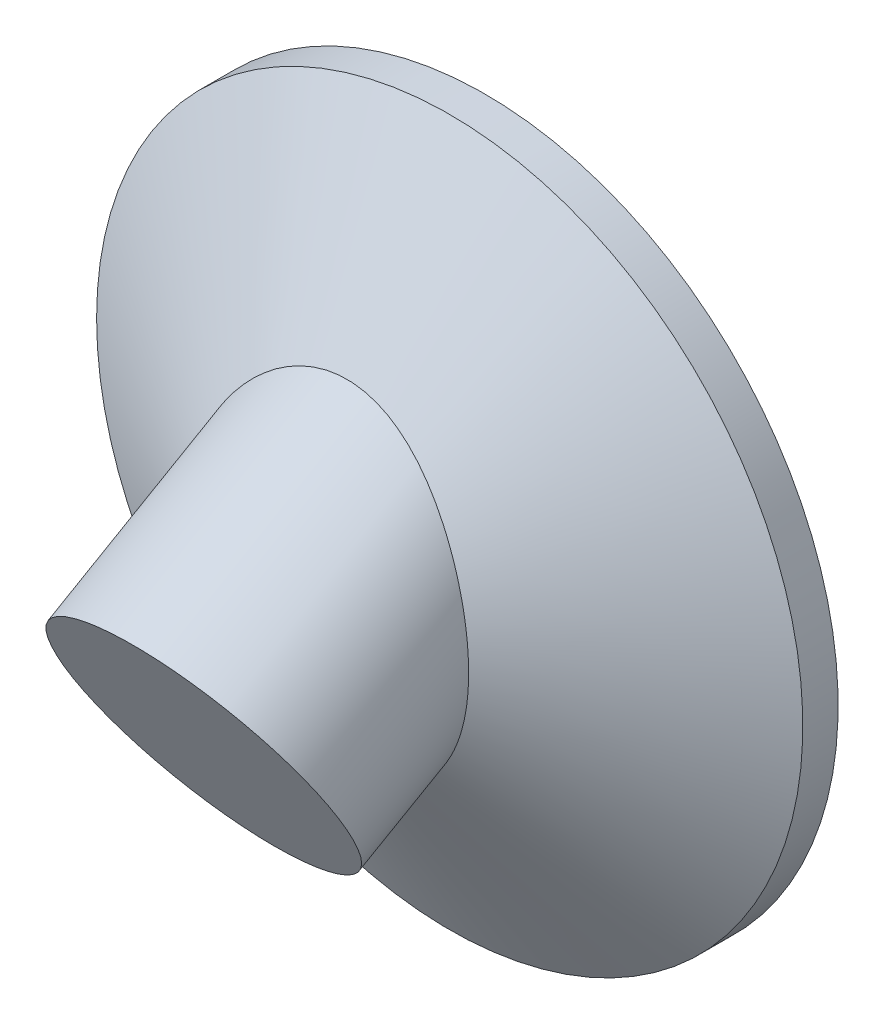
ISO-10303-21;
HEADER;
FILE_DESCRIPTION(('STEP AP214'),'2;1');
FILE_NAME('part.step','',(''),(''),'','','');
FILE_SCHEMA(('AUTOMOTIVE_DESIGN { 1 0 10303 214 1 1 1 1 }'));
ENDSEC;
DATA;
#1=APPLICATION_CONTEXT('core data for automotive mechanical design processes');
#2=APPLICATION_PROTOCOL_DEFINITION('international standard','automotive_design',2000,#1);
#3=PRODUCT_CONTEXT('',#1,'mechanical');
#4=PRODUCT('Part','Part','',(#3));
#5=PRODUCT_RELATED_PRODUCT_CATEGORY('part','',(#4));
#6=PRODUCT_DEFINITION_FORMATION('','',#4);
#7=PRODUCT_DEFINITION_CONTEXT('part definition',#1,'design');
#8=PRODUCT_DEFINITION('design','',#6,#7);
#9=PRODUCT_DEFINITION_SHAPE('','',#8);
#10=(LENGTH_UNIT() NAMED_UNIT(*) SI_UNIT(.MILLI.,.METRE.));
#11=(NAMED_UNIT(*) PLANE_ANGLE_UNIT() SI_UNIT($,.RADIAN.));
#12=(NAMED_UNIT(*) SI_UNIT($,.STERADIAN.) SOLID_ANGLE_UNIT());
#13=UNCERTAINTY_MEASURE_WITH_UNIT(LENGTH_MEASURE(1.E-05),#10,'distance_accuracy_value','');
#14=(GEOMETRIC_REPRESENTATION_CONTEXT(3) GLOBAL_UNCERTAINTY_ASSIGNED_CONTEXT((#13)) GLOBAL_UNIT_ASSIGNED_CONTEXT((#10,
#11,#12)) REPRESENTATION_CONTEXT('',''));
#15=CARTESIAN_POINT('',(0.,0.,0.));
#16=DIRECTION('',(0.,0.,1.));
#17=DIRECTION('',(1.,0.,0.));
#18=AXIS2_PLACEMENT_3D('',#15,#16,#17);
#19=CARTESIAN_POINT('',(0.,0.,400.));
#20=DIRECTION('',(0.,0.,-1.));
#21=DIRECTION('',(-1.,0.,0.));
#22=AXIS2_PLACEMENT_3D('',#19,#20,#21);
#23=CONICAL_SURFACE('',#22,393.782217350894,1.0471975511966);
#24=CARTESIAN_POINT('',(-229.09424891116,-365.963690831646,378.075589441035));
#25=CARTESIAN_POINT('',(-225.220985470825,-368.934261870913,377.808440544668));
#26=CARTESIAN_POINT('',(-221.292566342555,-371.833844226042,377.545559549312));
#27=CARTESIAN_POINT('',(-215.321028029195,-376.072422934504,377.158541626063));
#28=CARTESIAN_POINT('',(-213.317237199854,-377.466899573177,377.030745230166));
#29=CARTESIAN_POINT('',(-209.283781039525,-380.218387916195,376.777717117129));
#30=CARTESIAN_POINT('',(-207.254114465849,-381.575397811208,376.652485523923));
#31=CARTESIAN_POINT('',(-201.126098372854,-385.589973216121,376.280781087216));
#32=CARTESIAN_POINT('',(-196.989804597707,-388.190323212593,376.038368180554));
#33=CARTESIAN_POINT('',(-188.621579470081,-393.233207318196,375.56546856309));
#34=CARTESIAN_POINT('',(-184.389648412623,-395.675741914064,375.334981815507));
#35=CARTESIAN_POINT('',(-175.827738551275,-400.402550762964,374.8865468021));
#36=CARTESIAN_POINT('',(-171.497598577834,-402.686535466992,374.668621593584));
#37=CARTESIAN_POINT('',(-162.752280975462,-407.086882903538,374.246728166072));
#38=CARTESIAN_POINT('',(-158.337103103793,-409.203245157493,374.042759986924));
#39=CARTESIAN_POINT('',(-149.427873960284,-413.26395143235,373.649701345051));
#40=CARTESIAN_POINT('',(-144.93382587351,-415.208302380622,373.460610283217));
#41=CARTESIAN_POINT('',(-135.872937230799,-418.921050386896,373.098144944439));
#42=CARTESIAN_POINT('',(-131.306095524679,-420.689444661471,372.924770916123));
#43=CARTESIAN_POINT('',(-121.608637907434,-424.228064244648,372.576664271693));
#44=CARTESIAN_POINT('',(-116.470463517575,-425.977805496208,372.403812408992));
#45=CARTESIAN_POINT('',(-106.122060668215,-429.25194398588,372.079335628144));
#46=CARTESIAN_POINT('',(-100.911830808049,-430.776336836759,371.927711123269));
#47=CARTESIAN_POINT('',(-90.4284945048398,-433.59578917208,371.646524433281));
#48=CARTESIAN_POINT('',(-85.1553816576592,-434.890825081714,371.516964516164));
#49=CARTESIAN_POINT('',(-74.5568322866186,-437.247813221586,371.280654777672));
#50=CARTESIAN_POINT('',(-69.2313960689385,-438.309766814901,371.173904822903));
#51=CARTESIAN_POINT('',(-58.5401718055689,-440.197348663617,370.983846562697));
#52=CARTESIAN_POINT('',(-53.1743975079992,-441.023053995841,370.900530611985));
#53=CARTESIAN_POINT('',(-42.4112286019664,-442.43629333628,370.757764442436));
#54=CARTESIAN_POINT('',(-37.0138338752264,-443.023826453027,370.698314312927));
#55=CARTESIAN_POINT('',(-26.1984044518984,-443.959033844492,370.603619492256));
#56=CARTESIAN_POINT('',(-20.7803709602535,-444.306721912531,370.568373409135));
#57=CARTESIAN_POINT('',(-9.93414022671756,-444.761304732976,370.522281497984));
#58=CARTESIAN_POINT('',(-4.50594308695869,-444.868201892174,370.511435426066));
#59=CARTESIAN_POINT('',(6.09804818298498,-444.84154482305,370.514139281232));
#60=CARTESIAN_POINT('',(11.2738733353614,-444.718911691135,370.526581163707));
#61=CARTESIAN_POINT('',(21.6155643898023,-444.254727251323,370.573643791296));
#62=CARTESIAN_POINT('',(26.7814303821282,-443.91317793694,370.608264334446));
#63=CARTESIAN_POINT('',(37.0937638435603,-443.012053892686,370.699504554952));
#64=CARTESIAN_POINT('',(42.2402318399405,-442.452485132777,370.75612362993));
#65=CARTESIAN_POINT('',(52.5047031312823,-441.116755081609,370.891069584084));
#66=CARTESIAN_POINT('',(57.6227063583902,-440.340593274265,370.969396514984));
#67=CARTESIAN_POINT('',(67.820739089883,-438.573724025975,371.147348662458));
#68=CARTESIAN_POINT('',(72.9007715997711,-437.583033755731,371.24697217446));
#69=CARTESIAN_POINT('',(83.0143722640566,-435.389569673902,371.467010904498));
#70=CARTESIAN_POINT('',(88.0479404416382,-434.186795968145,371.587426112158));
#71=CARTESIAN_POINT('',(98.0599610625413,-431.572155313784,371.848434327165));
#72=CARTESIAN_POINT('',(103.03841319852,-430.16028719984,371.989027446968));
#73=CARTESIAN_POINT('',(112.931749036702,-427.130933774838,372.289676062289));
#74=CARTESIAN_POINT('',(117.846632748075,-425.513448493437,372.449731555001));
#75=CARTESIAN_POINT('',(127.593554059827,-422.08070016125,372.788107504203));
#76=CARTESIAN_POINT('',(132.425755195115,-420.265897115304,372.966385423141));
#77=CARTESIAN_POINT('',(142.01101491588,-416.439805838291,373.340613086317));
#78=CARTESIAN_POINT('',(146.764073543643,-414.428517712209,373.536562821114));
#79=CARTESIAN_POINT('',(156.183555605116,-410.214155578379,373.945152097404));
#80=CARTESIAN_POINT('',(160.849980288353,-408.011084339344,374.157791397952));
#81=CARTESIAN_POINT('',(170.089199732178,-403.418137007194,374.598704578814));
#82=CARTESIAN_POINT('',(174.661994429413,-401.028260787687,374.826978469707));
#83=CARTESIAN_POINT('',(183.707615734614,-396.066816552609,375.298048612042));
#84=CARTESIAN_POINT('',(188.180434340469,-393.495234061288,375.540846020272));
#85=CARTESIAN_POINT('',(197.019404171623,-388.176129426381,376.039747718072));
#86=CARTESIAN_POINT('',(201.385555587136,-385.42860759657,376.295851983911));
#87=CARTESIAN_POINT('',(210.005372755532,-379.763365018349,376.820113640516));
#88=CARTESIAN_POINT('',(214.259036091053,-376.845640616606,377.088271289975));
#89=CARTESIAN_POINT('',(222.64826790276,-370.846042053312,377.635319415051));
#90=CARTESIAN_POINT('',(226.783835550893,-367.764166741218,377.914209965891));
#91=CARTESIAN_POINT('',(235.117889815604,-361.297999290103,378.494315340448));
#92=CARTESIAN_POINT('',(239.310618602893,-357.90632342274,378.795967962119));
#93=CARTESIAN_POINT('',(247.555911173025,-350.957423067747,379.407900772524));
#94=CARTESIAN_POINT('',(251.608473867224,-347.400197294824,379.718181028233));
#95=CARTESIAN_POINT('',(259.56851461274,-340.127495628096,380.34570886134));
#96=CARTESIAN_POINT('',(263.475990965399,-336.412017882584,380.662956520244));
#97=CARTESIAN_POINT('',(271.141305159666,-328.830272902782,381.302711039202));
#98=CARTESIAN_POINT('',(274.899143186229,-324.964005854882,381.625217892756));
#99=CARTESIAN_POINT('',(282.261817427334,-317.087413841044,382.273812217063));
#100=CARTESIAN_POINT('',(285.866625127298,-313.077062282231,382.599900340999));
#101=CARTESIAN_POINT('',(292.91886249226,-304.920487518369,383.253827596048));
#102=CARTESIAN_POINT('',(296.36629251646,-300.774264623471,383.581666723162));
#103=CARTESIAN_POINT('',(303.100656318158,-292.35332624773,384.237311179028));
#104=CARTESIAN_POINT('',(306.387586190077,-288.078607644181,384.565116506764));
#105=CARTESIAN_POINT('',(312.798064318745,-279.408224545863,385.218874239426));
#106=CARTESIAN_POINT('',(315.921610793117,-275.01255873246,385.544826624103));
#107=CARTESIAN_POINT('',(322.245551346383,-265.752355520928,386.218919364916));
#108=CARTESIAN_POINT('',(325.432186553196,-260.87839418998,386.566754612076));
#109=CARTESIAN_POINT('',(331.60951303968,-251.007375212451,387.255824224914));
#110=CARTESIAN_POINT('',(334.600201760248,-246.010315959357,387.597058504341));
#111=CARTESIAN_POINT('',(340.383580243321,-235.902144736845,388.270619076197));
#112=CARTESIAN_POINT('',(343.176263879062,-230.791029244674,388.602945092784));
#113=CARTESIAN_POINT('',(348.561842464576,-220.463956089223,389.256365497953));
#114=CARTESIAN_POINT('',(351.154737919751,-215.247998691202,389.577459914947));
#115=CARTESIAN_POINT('',(356.14013031367,-204.718781839557,390.206198939203));
#116=CARTESIAN_POINT('',(358.532575801524,-199.405497828318,390.513840083693));
#117=CARTESIAN_POINT('',(363.115462807702,-188.691678853669,391.113303645544));
#118=CARTESIAN_POINT('',(365.30590481609,-183.291144101968,391.405126101282));
#119=CARTESIAN_POINT('',(369.484338187884,-172.411310010347,391.970705706057));
#120=CARTESIAN_POINT('',(371.472324885247,-166.932008858396,392.244462438679));
#121=CARTESIAN_POINT('',(375.245718187982,-155.902943170726,392.771698901836));
#122=CARTESIAN_POINT('',(377.031121995622,-150.353177663048,393.025178352322));
#123=CARTESIAN_POINT('',(379.639397818297,-141.710245809371,393.400356017744));
#124=CARTESIAN_POINT('',(380.533061020391,-138.638601631386,393.529906017155));
#125=CARTESIAN_POINT('',(382.259458188716,-132.478128924468,393.781890182506));
#126=CARTESIAN_POINT('',(383.092195325863,-129.389301298869,393.904324718704));
#127=CARTESIAN_POINT('',(385.499267416895,-120.098572803507,394.260453060488));
#128=CARTESIAN_POINT('',(386.982477470158,-113.872378483523,394.482973684637));
#129=CARTESIAN_POINT('',(389.706785176294,-101.366137281829,394.895515149423));
#130=CARTESIAN_POINT('',(390.947872738447,-95.0860881670451,395.085534635499));
#131=CARTESIAN_POINT('',(393.189361790001,-82.4822352846738,395.430517406922));
#132=CARTESIAN_POINT('',(394.18976404931,-76.1584316571161,395.585480804406));
#133=CARTESIAN_POINT('',(395.951827040482,-63.4756014143587,395.857966548034));
#134=CARTESIAN_POINT('',(396.713439767743,-57.1165679779511,395.975481365851));
#135=CARTESIAN_POINT('',(397.999736493526,-44.3740246204601,396.170781672208));
#136=CARTESIAN_POINT('',(398.524421058646,-37.9905147579474,396.248567255759));
#137=CARTESIAN_POINT('',(399.339220392167,-25.2080512846304,396.362351713658));
#138=CARTESIAN_POINT('',(399.629329864107,-18.8090973283863,396.398349644492));
#139=CARTESIAN_POINT('',(399.977541611632,-6.00476227159677,396.426708928268));
#140=CARTESIAN_POINT('',(400.035640827904,0.400618912584833,396.41906970581));
#141=CARTESIAN_POINT('',(399.916895507775,13.8539509949458,396.355486897264));
#142=CARTESIAN_POINT('',(399.71581060143,20.901674958211,396.294757972137));
#143=CARTESIAN_POINT('',(399.039800449357,34.9832934971929,396.116673215406));
#144=CARTESIAN_POINT('',(398.564870767675,42.0171878470345,395.999316466504));
#145=CARTESIAN_POINT('',(397.34519673797,56.0606717483376,395.706584758943));
#146=CARTESIAN_POINT('',(396.600438523704,63.0702600320397,395.531206818668));
#147=CARTESIAN_POINT('',(394.845260720247,77.0543054495546,395.121493256834));
#148=CARTESIAN_POINT('',(393.834841984062,84.0287626960959,394.88715782458));
#149=CARTESIAN_POINT('',(391.551732415246,97.9371783723273,394.358880475159));
#150=CARTESIAN_POINT('',(390.278864295746,104.871106151011,394.064898268228));
#151=CARTESIAN_POINT('',(387.475398125961,118.683820754577,393.41745479896));
#152=CARTESIAN_POINT('',(385.9448006078,125.562607693275,393.063993659428));
#153=CARTESIAN_POINT('',(382.629842191138,139.255545250513,392.298132454916));
#154=CARTESIAN_POINT('',(380.845477610209,146.069694929566,391.885731534656));
#155=CARTESIAN_POINT('',(377.026796192499,159.623849997966,391.003076451635));
#156=CARTESIAN_POINT('',(374.992476158011,166.363854437563,390.532821548742));
#157=CARTESIAN_POINT('',(370.486942280768,180.351736057563,389.492078729899));
#158=CARTESIAN_POINT('',(367.993013838857,187.591922738403,388.916407153076));
#159=CARTESIAN_POINT('',(362.717470339622,201.9613720189,387.701299789147));
#160=CARTESIAN_POINT('',(359.935850675339,209.090632840137,387.061862980941));
#161=CARTESIAN_POINT('',(354.08819356216,223.226961946335,385.722763469643));
#162=CARTESIAN_POINT('',(351.022117338315,230.23401341754,385.023092556839));
#163=CARTESIAN_POINT('',(344.608984461473,244.112402221913,383.568009645337));
#164=CARTESIAN_POINT('',(341.261929783574,250.983740508637,382.812598038465));
#165=CARTESIAN_POINT('',(334.289459636637,264.577539365937,381.251240716905));
#166=CARTESIAN_POINT('',(330.664055357284,271.30000590719,380.445297033849));
#167=CARTESIAN_POINT('',(323.136611908912,284.582821490004,378.788784252427));
#168=CARTESIAN_POINT('',(319.23456869395,291.143168158612,377.938214501436));
#169=CARTESIAN_POINT('',(311.156115412788,304.085703795532,376.199365927953));
#170=CARTESIAN_POINT('',(306.979762844528,310.467929702595,375.311095021717));
#171=CARTESIAN_POINT('',(298.352954577879,323.039765815508,373.504179994944));
#172=CARTESIAN_POINT('',(293.9025124599,329.229385541646,372.585537380288));
#173=CARTESIAN_POINT('',(285.670233512531,340.149201046714,370.917086996202));
#174=CARTESIAN_POINT('',(281.938774070721,344.918075752723,370.1713480484));
#175=CARTESIAN_POINT('',(274.30332739636,354.314064739425,368.670404181763));
#176=CARTESIAN_POINT('',(270.39934527088,358.941183209574,367.915199543607));
#177=CARTESIAN_POINT('',(262.419056778225,368.043618803969,366.400112322208));
#178=CARTESIAN_POINT('',(258.342750986861,372.51893643536,365.640229754603));
#179=CARTESIAN_POINT('',(250.018143202303,381.306894814913,364.120889071951));
#180=CARTESIAN_POINT('',(245.769840511692,385.61953490331,363.361430958638));
#181=CARTESIAN_POINT('',(237.107779599361,394.064558393936,361.849390403487));
#182=CARTESIAN_POINT('',(232.69425336545,398.197178121643,361.096800039618));
#183=CARTESIAN_POINT('',(223.697338521525,406.275698796323,359.603146941146));
#184=CARTESIAN_POINT('',(219.113947724779,410.221597338073,358.862084355119));
#185=CARTESIAN_POINT('',(209.779941533539,417.912200402245,357.39763239131));
#186=CARTESIAN_POINT('',(205.029357036351,421.656941778615,356.674239789548));
#187=CARTESIAN_POINT('',(195.36284580475,428.931247279972,355.251273537424));
#188=CARTESIAN_POINT('',(190.446928614812,432.460823793219,354.551698516775));
#189=CARTESIAN_POINT('',(181.555834076895,438.536034975375,353.333858828058));
#190=CARTESIAN_POINT('',(177.612355619743,441.126964436715,352.809641066236));
#191=CARTESIAN_POINT('',(169.629481118962,446.161021528527,351.782767572508));
#192=CARTESIAN_POINT('',(165.590088757442,448.604154820121,351.280111014947));
#193=CARTESIAN_POINT('',(157.418500652464,453.33456876027,350.29958163941));
#194=CARTESIAN_POINT('',(153.286312610203,455.621862279019,349.821706775593));
#195=CARTESIAN_POINT('',(144.932277029174,460.03277250458,348.893898532271));
#196=CARTESIAN_POINT('',(140.71042875076,462.156387860472,348.443965383389));
#197=CARTESIAN_POINT('',(132.183539240265,466.230734418608,347.575457458847));
#198=CARTESIAN_POINT('',(127.878541521353,468.181553213392,347.156866812154));
#199=CARTESIAN_POINT('',(119.188327414371,471.90343238282,346.353918195114));
#200=CARTESIAN_POINT('',(114.803111292102,473.674493352957,345.969560111362));
#201=CARTESIAN_POINT('',(105.958189238656,477.029025666316,345.238081865616));
#202=CARTESIAN_POINT('',(101.49848065519,478.612490313894,344.890963032799));
#203=CARTESIAN_POINT('',(92.5115075182782,481.58420048932,344.236838927724));
#204=CARTESIAN_POINT('',(87.9842428490879,482.972445682652,343.929833724203));
#205=CARTESIAN_POINT('',(78.8334305135164,485.556948889214,343.356299101461));
#206=CARTESIAN_POINT('',(74.2094026713176,486.751585231566,343.090112485429));
#207=CARTESIAN_POINT('',(64.9092436246153,488.928839917327,342.603604093495));
#208=CARTESIAN_POINT('',(60.2331123572087,489.911458004744,342.383282372972));
#209=CARTESIAN_POINT('',(50.8382362460436,491.659082258401,341.990574769155));
#210=CARTESIAN_POINT('',(46.1194907545773,492.424085111274,341.818189615736));
#211=CARTESIAN_POINT('',(36.6497415719079,493.731922489264,341.52302891113));
#212=CARTESIAN_POINT('',(31.8987379742758,494.274757658545,341.400253216102));
#213=CARTESIAN_POINT('',(22.377415700425,495.134760769312,341.205568060949));
#214=CARTESIAN_POINT('',(17.607106551201,495.452028938819,341.133636009137));
#215=CARTESIAN_POINT('',(8.05624742165371,495.8593197148,341.041270423798));
#216=CARTESIAN_POINT('',(3.27569736805889,495.949340689895,341.020837259975));
#217=CARTESIAN_POINT('',(-6.28377799514524,495.901573355906,341.031675352884));
#218=CARTESIAN_POINT('',(-11.062703409322,495.76380469358,341.062942150518));
#219=CARTESIAN_POINT('',(-20.6078962398531,495.261352832088,341.176858206512));
#220=CARTESIAN_POINT('',(-25.374164008988,494.896676025158,341.259506017416));
#221=CARTESIAN_POINT('',(-34.3021926357603,494.000965374208,341.462165243639));
#222=CARTESIAN_POINT('',(-38.4666948006072,493.49568573129,341.576381231297));
#223=CARTESIAN_POINT('',(-46.7700918823694,492.314407246181,341.84289273137));
#224=CARTESIAN_POINT('',(-50.9089874816126,491.638412973202,341.995187224605));
#225=CARTESIAN_POINT('',(-59.153893564364,490.118855596192,342.336706570911));
#226=CARTESIAN_POINT('',(-63.2599073055066,489.2753093108,342.525927717303));
#227=CARTESIAN_POINT('',(-71.4330125988831,487.424316625367,342.939936742597));
#228=CARTESIAN_POINT('',(-75.5001038481266,486.416868950541,343.16472489813));
#229=CARTESIAN_POINT('',(-83.5896211569267,484.242260010554,343.648299608422));
#230=CARTESIAN_POINT('',(-87.6120436571758,483.075086115378,343.907088851681));
#231=CARTESIAN_POINT('',(-95.6063722655435,480.585812490652,344.456884272301));
#232=CARTESIAN_POINT('',(-99.5782785232113,479.263713219864,344.747890354261));
#233=CARTESIAN_POINT('',(-107.466797047597,476.469599635275,345.36022021562));
#234=CARTESIAN_POINT('',(-111.383406755002,474.997578408303,345.681545393035));
#235=CARTESIAN_POINT('',(-119.156729093116,471.909008387624,346.35247293656));
#236=CARTESIAN_POINT('',(-123.013441332372,470.292458649831,346.70207548738));
#237=CARTESIAN_POINT('',(-130.830908763307,466.846354162664,347.443358349986));
#238=CARTESIAN_POINT('',(-134.788804017466,465.010565522596,347.836211861892));
#239=CARTESIAN_POINT('',(-142.631236898864,461.193879001605,348.647955039301));
#240=CARTESIAN_POINT('',(-146.515774035908,459.212980151453,349.066844878705));
#241=CARTESIAN_POINT('',(-154.207977975652,455.112602634636,349.928122068773));
#242=CARTESIAN_POINT('',(-158.015649541989,452.993132590447,350.370507957095));
#243=CARTESIAN_POINT('',(-165.551915357256,448.62168084465,351.276313663922));
#244=CARTESIAN_POINT('',(-169.280503725894,446.369689335969,351.739735038548));
#245=CARTESIAN_POINT('',(-176.657734655704,441.738506180182,352.685286981352));
#246=CARTESIAN_POINT('',(-180.306340159773,439.359257258621,353.16742594649));
#247=CARTESIAN_POINT('',(-187.520280960257,434.480385948874,354.147768199093));
#248=CARTESIAN_POINT('',(-191.085610185128,431.980754824237,354.645972651603));
#249=CARTESIAN_POINT('',(-198.131517232067,426.866950969149,355.656012575823));
#250=CARTESIAN_POINT('',(-201.612089375511,424.2527705967,356.167848956073));
#251=CARTESIAN_POINT('',(-208.487148857583,418.915614699451,357.202749626089));
#252=CARTESIAN_POINT('',(-211.881632890664,416.192635007365,357.725814345573));
#253=CARTESIAN_POINT('',(-220.341777601518,409.187463204748,359.057628437152));
#254=CARTESIAN_POINT('',(-225.349942350493,404.836697082661,359.872295686348));
#255=CARTESIAN_POINT('',(-235.162008084117,395.912606777099,361.514481346626));
#256=CARTESIAN_POINT('',(-239.96589030725,391.339262234156,362.342000928592));
#257=CARTESIAN_POINT('',(-249.369451117794,381.985144546359,364.002686883474));
#258=CARTESIAN_POINT('',(-253.969058825338,377.204300522932,364.835855102559));
#259=CARTESIAN_POINT('',(-262.961427315393,367.452020187391,366.500513226962));
#260=CARTESIAN_POINT('',(-267.354193064072,362.480588456395,367.332003172114));
#261=CARTESIAN_POINT('',(-275.93884351379,352.353603028574,368.987965605379));
#262=CARTESIAN_POINT('',(-280.130427173893,347.197792388229,369.812426146679));
#263=CARTESIAN_POINT('',(-288.305624515201,336.7217074598,371.446967558633));
#264=CARTESIAN_POINT('',(-292.289236992553,331.401432219988,372.257048346031));
#265=CARTESIAN_POINT('',(-300.04769526174,320.608917999422,373.857037826784));
#266=CARTESIAN_POINT('',(-303.822566397881,315.136697588798,374.646948962739));
#267=CARTESIAN_POINT('',(-311.163617495185,304.05059426256,376.201458737426));
#268=CARTESIAN_POINT('',(-314.729797378304,298.436711293969,376.966057366691));
#269=CARTESIAN_POINT('',(-321.710272336521,286.983121999546,378.477589276482));
#270=CARTESIAN_POINT('',(-325.121062986722,281.141213903301,379.224018549248));
#271=CARTESIAN_POINT('',(-331.725264994152,269.331465027257,380.681185430371));
#272=CARTESIAN_POINT('',(-334.918675800799,263.363623928544,381.391922948326));
#273=CARTESIAN_POINT('',(-341.086757961336,251.311453650894,382.773607520476));
#274=CARTESIAN_POINT('',(-344.061429037213,245.227124323915,383.444554524096));
#275=CARTESIAN_POINT('',(-349.790303754038,232.951006498305,384.743033738358));
#276=CARTESIAN_POINT('',(-352.544507295595,226.75921795123,385.370565929427));
#277=CARTESIAN_POINT('',(-357.829478119657,214.27897143149,386.578869000885));
#278=CARTESIAN_POINT('',(-360.360319348861,207.990546267137,387.159655351382));
#279=CARTESIAN_POINT('',(-365.197137826569,195.32356195941,388.272032396187));
#280=CARTESIAN_POINT('',(-367.503116378739,188.94500333884,388.803623375708));
#281=CARTESIAN_POINT('',(-371.88761191429,176.105666915311,389.815465060889));
#282=CARTESIAN_POINT('',(-373.966113800086,169.64488368685,390.29571235883));
#283=CARTESIAN_POINT('',(-377.892452716686,156.649809416777,391.203131605254));
#284=CARTESIAN_POINT('',(-379.740284739349,150.115516782538,391.630302401377));
#285=CARTESIAN_POINT('',(-383.462535880143,135.993233448727,392.490547556901));
#286=CARTESIAN_POINT('',(-385.299087550205,128.394690328364,392.914831414659));
#287=CARTESIAN_POINT('',(-388.657112251918,113.124451404772,393.690383682558));
#288=CARTESIAN_POINT('',(-390.178577740983,105.452753854956,394.041650344802));
#289=CARTESIAN_POINT('',(-392.900959635669,90.0488534908037,394.670890931372));
#290=CARTESIAN_POINT('',(-394.101843898497,82.3166446893017,394.948857506295));
#291=CARTESIAN_POINT('',(-396.177157110564,66.806287480312,395.431910192328));
#292=CARTESIAN_POINT('',(-397.05158834334,59.0281393945559,395.636996813233));
#293=CARTESIAN_POINT('',(-398.468493283644,43.4381402911674,395.975523027825));
#294=CARTESIAN_POINT('',(-399.010885883151,35.6262815078516,396.108945114837));
#295=CARTESIAN_POINT('',(-399.757807509011,19.9854594753809,396.305934362691));
#296=CARTESIAN_POINT('',(-399.962335337212,12.1564961656677,396.369501275807));
#297=CARTESIAN_POINT('',(-400.028188881177,-3.50276873309073,396.429270549296));
#298=CARTESIAN_POINT('',(-399.889533142909,-11.3330702269528,396.425476549847));
#299=CARTESIAN_POINT('',(-399.26407367226,-26.9794896610579,396.353589595992));
#300=CARTESIAN_POINT('',(-398.777272739621,-34.7956077148559,396.285497158665));
#301=CARTESIAN_POINT('',(-397.471758128922,-50.1530401057864,396.091657990844));
#302=CARTESIAN_POINT('',(-396.663905314671,-57.6953013366461,395.967781708727));
#303=CARTESIAN_POINT('',(-394.71364860605,-72.7354202109292,395.666668524368));
#304=CARTESIAN_POINT('',(-393.57124663045,-80.2332781087714,395.489431928167));
#305=CARTESIAN_POINT('',(-390.948798878948,-95.1687613155302,395.085556899332));
#306=CARTESIAN_POINT('',(-389.468739207978,-102.606384132646,394.858916433679));
#307=CARTESIAN_POINT('',(-386.168623134692,-117.404366606573,394.360491535784));
#308=CARTESIAN_POINT('',(-384.348566835253,-124.764726286762,394.088707117201));
#309=CARTESIAN_POINT('',(-380.36623354869,-139.393052962639,393.504399558312));
#310=CARTESIAN_POINT('',(-378.20385606031,-146.660992145723,393.191864458878));
#311=CARTESIAN_POINT('',(-373.536425185696,-161.084486995214,392.530802950073));
#312=CARTESIAN_POINT('',(-371.031369388365,-168.240041870487,392.182276287469));
#313=CARTESIAN_POINT('',(-365.679070397126,-182.419318616125,391.454126619506));
#314=CARTESIAN_POINT('',(-362.831875274467,-189.44305884675,391.074507985013));
#315=CARTESIAN_POINT('',(-356.796112838545,-203.340776783391,390.289088104824));
#316=CARTESIAN_POINT('',(-353.607555310531,-210.214758775474,389.88328760977));
#317=CARTESIAN_POINT('',(-347.220559950284,-223.127888496239,389.091366142842));
#318=CARTESIAN_POINT('',(-344.053730125123,-229.182818670199,388.707215472658));
#319=CARTESIAN_POINT('',(-337.446362093159,-241.140898220417,387.925414772515));
#320=CARTESIAN_POINT('',(-334.005828634535,-247.044050227357,387.527764976807));
#321=CARTESIAN_POINT('',(-328.642251059602,-255.773781944661,386.923976202767));
#322=CARTESIAN_POINT('',(-326.820355938148,-258.663212108644,386.721468570843));
#323=CARTESIAN_POINT('',(-323.109461755839,-264.398498846667,386.314483401656));
#324=CARTESIAN_POINT('',(-321.220464322237,-267.244356474962,386.11000591225));
#325=CARTESIAN_POINT('',(-317.375970489193,-272.890517702768,385.699554827522));
#326=CARTESIAN_POINT('',(-315.420476839807,-275.690823179096,385.493581294347));
#327=CARTESIAN_POINT('',(-311.44338168968,-281.244317078823,385.080579787846));
#328=CARTESIAN_POINT('',(-309.421774270466,-283.997501250154,384.873551721527));
#329=CARTESIAN_POINT('',(-303.273230026004,-292.164247780098,384.253044595165));
#330=CARTESIAN_POINT('',(-299.04898103007,-297.504973549514,383.838686218533));
#331=CARTESIAN_POINT('',(-290.346896008517,-307.975755537058,383.011324107562));
#332=CARTESIAN_POINT('',(-285.869064638677,-313.105815620031,382.598320348499));
#333=CARTESIAN_POINT('',(-278.969344640212,-320.629544370788,381.982685288861));
#334=CARTESIAN_POINT('',(-276.639683634967,-323.108161143936,381.778180712059));
#335=CARTESIAN_POINT('',(-271.919898868817,-328.007063047215,381.370851132359));
#336=CARTESIAN_POINT('',(-269.529779264596,-330.4273521653,381.168026015261));
#337=CARTESIAN_POINT('',(-264.690440581602,-335.207418834717,380.764517036713));
#338=CARTESIAN_POINT('',(-262.241231695182,-337.567206679142,380.563832814472));
#339=CARTESIAN_POINT('',(-257.284453167684,-342.224817730073,380.165001354042));
#340=CARTESIAN_POINT('',(-254.77688491999,-344.522642413184,379.966854055457));
#341=CARTESIAN_POINT('',(-250.372470109548,-348.457750777585,379.625311556048));
#342=CARTESIAN_POINT('',(-248.488692726178,-350.109630413946,379.481239180372));
#343=CARTESIAN_POINT('',(-244.690924335936,-353.377758612238,379.194890792672));
#344=CARTESIAN_POINT('',(-242.776938829968,-354.994013535847,379.05261446189));
#345=CARTESIAN_POINT('',(-238.918813216712,-358.190573038493,378.769987174225));
#346=CARTESIAN_POINT('',(-236.97467114076,-359.77087525373,378.629636344178));
#347=CARTESIAN_POINT('',(-233.056617823213,-362.894922513368,378.351011645874));
#348=CARTESIAN_POINT('',(-231.082701733718,-364.438661496918,378.21273812333));
#349=CARTESIAN_POINT('',(-229.09424891116,-365.963690831646,378.075589441035));
#350=B_SPLINE_CURVE_WITH_KNOTS('',3,(#24,#25,#26,#27,#28,#29,#30,#31,#32,#33,#34,#35,#36,#37,
#38,#39,#40,#41,#42,#43,#44,#45,#46,#47,#48,#49,#50,#51,#52,#53,#54,#55,#56,#57,#58,#59,#60,#61,
#62,#63,#64,#65,#66,#67,#68,#69,#70,#71,#72,#73,#74,#75,#76,#77,#78,#79,#80,#81,#82,#83,#84,#85,
#86,#87,#88,#89,#90,#91,#92,#93,#94,#95,#96,#97,#98,#99,#100,#101,#102,#103,#104,#105,#106,#107,
#108,#109,#110,#111,#112,#113,#114,#115,#116,#117,#118,#119,#120,#121,#122,#123,#124,#125,#126,
#127,#128,#129,#130,#131,#132,#133,#134,#135,#136,#137,#138,#139,#140,#141,#142,#143,#144,#145,
#146,#147,#148,#149,#150,#151,#152,#153,#154,#155,#156,#157,#158,#159,#160,#161,#162,#163,#164,
#165,#166,#167,#168,#169,#170,#171,#172,#173,#174,#175,#176,#177,#178,#179,#180,#181,#182,#183,
#184,#185,#186,#187,#188,#189,#190,#191,#192,#193,#194,#195,#196,#197,#198,#199,#200,#201,#202,
#203,#204,#205,#206,#207,#208,#209,#210,#211,#212,#213,#214,#215,#216,#217,#218,#219,#220,#221,
#222,#223,#224,#225,#226,#227,#228,#229,#230,#231,#232,#233,#234,#235,#236,#237,#238,#239,#240,
#241,#242,#243,#244,#245,#246,#247,#248,#249,#250,#251,#252,#253,#254,#255,#256,#257,#258,#259,
#260,#261,#262,#263,#264,#265,#266,#267,#268,#269,#270,#271,#272,#273,#274,#275,#276,#277,#278,
#279,#280,#281,#282,#283,#284,#285,#286,#287,#288,#289,#290,#291,#292,#293,#294,#295,#296,#297,
#298,#299,#300,#301,#302,#303,#304,#305,#306,#307,#308,#309,#310,#311,#312,#313,#314,#315,#316,
#317,#318,#319,#320,#321,#322,#323,#324,#325,#326,#327,#328,#329,#330,#331,#332,#333,#334,#335,
#336,#337,#338,#339,#340,#341,#342,#343,#344,#345,#346,#347,#348,#349),.UNSPECIFIED.,.T.,.F.,(4,
2,2,2,2,2,2,2,2,2,2,2,2,2,2,2,2,2,2,2,2,2,2,2,2,2,2,2,2,2,2,2,2,2,2,2,2,2,2,2,2,2,2,2,2,2,2,2,2,
2,2,2,2,2,2,2,2,2,2,2,2,2,2,2,2,2,2,2,2,2,2,2,2,2,2,2,2,2,2,2,2,2,2,2,2,2,2,2,2,2,2,2,2,2,2,2,2,
2,2,2,2,2,2,2,2,2,2,2,2,2,2,2,2,2,2,2,2,2,2,2,2,2,2,2,2,2,2,2,2,2,2,2,2,2,2,2,2,2,2,2,2,2,2,2,2,
2,2,2,2,2,2,2,2,2,2,2,2,2,2,2,2,2,4),(0.,14.6651117802062,21.9985754457751,29.3323926390538,
44.0039746759131,58.6755114600799,73.3731729530747,88.0708764064213,102.767987672949,
117.465331393516,133.752123216066,150.039232079069,166.328014067417,182.616700795635,
198.900067207125,215.183494565883,231.465985398048,247.748313480044,263.275544311198,
278.802633748945,294.329298042775,309.855999332922,325.381458336273,340.906909592499,
356.432447379502,371.957982927113,387.448070066268,402.938148928763,418.42800420273,
433.917869957154,449.408971116345,464.900044649042,480.391450814055,495.882965573487,
512.082252465602,528.281665146423,544.481267428824,560.680849687606,576.883437329147,
593.085987987886,609.288932720173,625.49205417616,642.988201709696,660.484577701132,
677.981494837244,695.478367710077,712.97971795579,730.481025741824,747.982736793958,
765.484689520632,775.089003580506,784.69281742472,803.900295215521,823.108573328098,
842.316789996057,861.528865679185,880.740895417576,899.953358931424,919.166075782044,
940.312919608976,961.460105998909,982.608379277757,1003.75658465275,1024.91912290682,
1046.08161746796,1067.24441915068,1088.40749159969,1111.43878532209,1134.4704479144,
1157.50525463313,1180.53989944559,1203.57361874705,1226.60767499433,1249.63691839053,
1272.66502166535,1290.96417540537,1309.26278781036,1327.5613390762,1345.85996454677,
1364.13379583754,1382.40786245619,1400.67856958887,1418.94822377795,1433.18764973142,
1447.42652991819,1461.6642327429,1475.90205306602,1490.13261427129,1504.36312833268,
1518.5941501533,1532.82519635896,1547.16988666666,1561.51459429422,1575.85952031993,
1590.20440475306,1604.54291121661,1618.88152061422,1633.21889337748,1647.55586226045,
1660.14199224386,1672.72778539263,1685.31231583493,1697.8969441614,1710.4825681664,
1723.06815490404,1735.65432224858,1748.24057181418,1761.37907480033,1774.5176655499,
1787.65543953828,1800.79418699551,1813.93889836949,1827.08456513128,1840.23111022763,
1853.37815935324,1873.42225946844,1893.46819649581,1913.52103563779,1933.5733930757,
1953.65487595717,1973.73647506845,1993.81563059692,2013.8947936343,2034.30730350604,
2054.71986507686,2075.13245259116,2095.54504930796,2115.95086264643,2136.35655767294,
2156.76360620139,2177.17109771619,2200.6504926646,2224.13044960184,2247.61275985278,
2271.09490584202,2294.5827855955,2318.07074864272,2341.55744240568,2365.04394729355,
2387.79564339616,2410.54720901148,2433.29971105328,2456.05220621068,2478.81139364901,
2501.57074123011,2524.32689480875,2547.08239625041,2567.60725533914,2588.13175844247,
2598.39656885022,2608.66113050271,2618.92526816301,2629.19032719282,2649.64792298538,
2670.10514329773,2680.32749662982,2690.54914904894,2700.76905075872,2710.9887087088,
2718.51709463682,2726.04412511007,2733.57164904454,2741.1004121565),.UNSPECIFIED.);
#351=CARTESIAN_POINT('',(-229.09424891116,-365.963690831646,378.075589441035));
#352=VERTEX_POINT('',#351);
#353=EDGE_CURVE('E134',#352,#352,#350,.T.);
#354=ORIENTED_EDGE('',*,*,#353,.F.);
#355=EDGE_LOOP('',(#354));
#356=FACE_BOUND('',#355,.T.);
#357=CARTESIAN_POINT('',(0.,0.,50.));
#358=DIRECTION('',(0.,0.,-1.));
#359=DIRECTION('',(-1.,0.,0.));
#360=AXIS2_PLACEMENT_3D('',#357,#358,#359);
#361=CIRCLE('',#360,1000.);
#362=CARTESIAN_POINT('',(-1000.,0.,50.));
#363=VERTEX_POINT('',#362);
#364=EDGE_CURVE('E71',#363,#363,#361,.T.);
#365=ORIENTED_EDGE('',*,*,#364,.F.);
#366=EDGE_LOOP('',(#365));
#367=FACE_BOUND('',#366,.T.);
#368=ADVANCED_FACE('F46',(#356,#367),#23,.T.);
#369=CARTESIAN_POINT('',(0.,0.,-819.038383133559));
#370=DIRECTION('',(0.,0.,-1.));
#371=DIRECTION('',(-1.,0.,0.));
#372=AXIS2_PLACEMENT_3D('',#369,#370,#371);
#373=CYLINDRICAL_SURFACE('',#372,1000.);
#374=CARTESIAN_POINT('',(0.,0.,-50.));
#375=DIRECTION('',(0.,0.,-1.));
#376=DIRECTION('',(-1.,0.,0.));
#377=AXIS2_PLACEMENT_3D('',#374,#375,#376);
#378=CIRCLE('',#377,1000.);
#379=CARTESIAN_POINT('',(-1000.,0.,-50.));
#380=VERTEX_POINT('',#379);
#381=EDGE_CURVE('E79',#380,#380,#378,.T.);
#382=ORIENTED_EDGE('',*,*,#381,.F.);
#383=EDGE_LOOP('',(#382));
#384=FACE_BOUND('',#383,.T.);
#385=ORIENTED_EDGE('',*,*,#364,.T.);
#386=EDGE_LOOP('',(#385));
#387=FACE_BOUND('',#386,.T.);
#388=ADVANCED_FACE('F116',(#384,#387),#373,.T.);
#389=CARTESIAN_POINT('',(0.,0.,-50.));
#390=DIRECTION('',(0.,0.,1.));
#391=DIRECTION('',(1.,0.,0.));
#392=AXIS2_PLACEMENT_3D('',#389,#390,#391);
#393=CONICAL_SURFACE('',#392,1000.,1.0471975511966);
#394=CARTESIAN_POINT('',(0.,0.,-400.));
#395=DIRECTION('',(0.,0.,-1.));
#396=DIRECTION('',(-1.,0.,0.));
#397=AXIS2_PLACEMENT_3D('',#394,#395,#396);
#398=CIRCLE('',#397,393.782217350894);
#399=CARTESIAN_POINT('',(-393.782217350894,0.,-400.));
#400=VERTEX_POINT('',#399);
#401=EDGE_CURVE('E142',#400,#400,#398,.T.);
#402=ORIENTED_EDGE('',*,*,#401,.F.);
#403=EDGE_LOOP('',(#402));
#404=FACE_BOUND('',#403,.T.);
#405=ORIENTED_EDGE('',*,*,#381,.T.);
#406=EDGE_LOOP('',(#405));
#407=FACE_BOUND('',#406,.T.);
#408=ADVANCED_FACE('F120',(#404,#407),#393,.T.);
#409=CARTESIAN_POINT('',(-393.782217350894,0.,-400.));
#410=DIRECTION('',(0.,0.,1.));
#411=DIRECTION('',(1.,0.,0.));
#412=AXIS2_PLACEMENT_3D('',#409,#410,#411);
#413=PLANE('',#412);
#414=ORIENTED_EDGE('',*,*,#401,.T.);
#415=EDGE_LOOP('',(#414));
#416=FACE_BOUND('',#415,.T.);
#417=ADVANCED_FACE('F124',(#416),#413,.F.);
#418=CARTESIAN_POINT('',(0.,596.410844526479,-633.013884904921));
#419=DIRECTION('',(0.,-0.500000000000001,0.866025403784438));
#420=DIRECTION('',(0.,-0.866025403784438,-0.500000000000001));
#421=AXIS2_PLACEMENT_3D('',#418,#419,#420);
#422=CYLINDRICAL_SURFACE('',#421,400.);
#423=CARTESIAN_POINT('',(0.,-200.,746.410161513775));
#424=DIRECTION('',(0.,-0.500000000000001,0.866025403784438));
#425=DIRECTION('',(0.,-0.866025403784438,-0.500000000000001));
#426=AXIS2_PLACEMENT_3D('',#423,#424,#425);
#427=CIRCLE('',#426,400.);
#428=CARTESIAN_POINT('',(0.,-546.410161513776,546.410161513775));
#429=VERTEX_POINT('',#428);
#430=EDGE_CURVE('E143',#429,#429,#427,.T.);
#431=ORIENTED_EDGE('',*,*,#430,.F.);
#432=EDGE_LOOP('',(#431));
#433=FACE_BOUND('',#432,.T.);
#434=ORIENTED_EDGE('',*,*,#353,.T.);
#435=EDGE_LOOP('',(#434));
#436=FACE_BOUND('',#435,.T.);
#437=ADVANCED_FACE('F127',(#433,#436),#422,.T.);
#438=CARTESIAN_POINT('',(0.,-200.,746.410161513775));
#439=DIRECTION('',(0.,-0.500000000000001,0.866025403784438));
#440=DIRECTION('',(0.,-0.866025403784438,-0.500000000000001));
#441=AXIS2_PLACEMENT_3D('',#438,#439,#440);
#442=PLANE('',#441);
#443=ORIENTED_EDGE('',*,*,#430,.T.);
#444=EDGE_LOOP('',(#443));
#445=FACE_BOUND('',#444,.T.);
#446=ADVANCED_FACE('F157',(#445),#442,.T.);
#447=CLOSED_SHELL('',(#368,#388,#408,#417,#437,#446));
#448=CARTESIAN_POINT('',(-393.782217350894,0.,-390.));
#449=DIRECTION('',(0.,0.,1.));
#450=DIRECTION('',(1.,0.,0.));
#451=AXIS2_PLACEMENT_3D('',#448,#449,#450);
#452=PLANE('',#451);
#453=CARTESIAN_POINT('',(0.,0.,-390.));
#454=DIRECTION('',(0.,0.,-1.));
#455=DIRECTION('',(-1.,0.,0.));
#456=AXIS2_PLACEMENT_3D('',#453,#454,#455);
#457=CIRCLE('',#456,391.102725426583);
#458=CARTESIAN_POINT('',(-391.102725426583,0.,-390.));
#459=VERTEX_POINT('',#458);
#460=EDGE_CURVE('E11',#459,#459,#457,.T.);
#461=ORIENTED_EDGE('',*,*,#460,.F.);
#462=EDGE_LOOP('',(#461));
#463=FACE_BOUND('',#462,.T.);
#464=ADVANCED_FACE('F48',(#463),#452,.T.);
#465=CARTESIAN_POINT('',(0.,0.,-44.2264973081038));
#466=DIRECTION('',(0.,0.,1.));
#467=DIRECTION('',(1.,0.,0.));
#468=AXIS2_PLACEMENT_3D('',#465,#466,#467);
#469=CONICAL_SURFACE('',#468,990.,1.0471975511966);
#470=ORIENTED_EDGE('',*,*,#460,.T.);
#471=EDGE_LOOP('',(#470));
#472=FACE_BOUND('',#471,.T.);
#473=CARTESIAN_POINT('',(0.,0.,-44.2264973081038));
#474=DIRECTION('',(0.,0.,-1.));
#475=DIRECTION('',(-1.,0.,0.));
#476=AXIS2_PLACEMENT_3D('',#473,#474,#475);
#477=CIRCLE('',#476,990.);
#478=CARTESIAN_POINT('',(-990.,0.,-44.2264973081038));
#479=VERTEX_POINT('',#478);
#480=EDGE_CURVE('E55',#479,#479,#477,.T.);
#481=ORIENTED_EDGE('',*,*,#480,.F.);
#482=EDGE_LOOP('',(#481));
#483=FACE_BOUND('',#482,.T.);
#484=ADVANCED_FACE('F92',(#472,#483),#469,.F.);
#485=CARTESIAN_POINT('',(0.,0.,-819.038383133559));
#486=DIRECTION('',(0.,0.,-1.));
#487=DIRECTION('',(-1.,0.,0.));
#488=AXIS2_PLACEMENT_3D('',#485,#486,#487);
#489=CYLINDRICAL_SURFACE('',#488,990.);
#490=ORIENTED_EDGE('',*,*,#480,.T.);
#491=EDGE_LOOP('',(#490));
#492=FACE_BOUND('',#491,.T.);
#493=CARTESIAN_POINT('',(0.,0.,44.2264973081038));
#494=DIRECTION('',(0.,0.,-1.));
#495=DIRECTION('',(-1.,0.,0.));
#496=AXIS2_PLACEMENT_3D('',#493,#494,#495);
#497=CIRCLE('',#496,990.);
#498=CARTESIAN_POINT('',(-990.,0.,44.2264973081038));
#499=VERTEX_POINT('',#498);
#500=EDGE_CURVE('E76',#499,#499,#497,.T.);
#501=ORIENTED_EDGE('',*,*,#500,.F.);
#502=EDGE_LOOP('',(#501));
#503=FACE_BOUND('',#502,.T.);
#504=ADVANCED_FACE('F89',(#492,#503),#489,.F.);
#505=CARTESIAN_POINT('',(0.,0.,390.));
#506=DIRECTION('',(0.,0.,-1.));
#507=DIRECTION('',(-1.,0.,0.));
#508=AXIS2_PLACEMENT_3D('',#505,#506,#507);
#509=CONICAL_SURFACE('',#508,391.102725426583,1.0471975511966);
#510=ORIENTED_EDGE('',*,*,#500,.T.);
#511=EDGE_LOOP('',(#510));
#512=FACE_BOUND('',#511,.T.);
#513=CARTESIAN_POINT('',(0.,0.,390.));
#514=DIRECTION('',(0.,0.,-1.));
#515=DIRECTION('',(-1.,0.,0.));
#516=AXIS2_PLACEMENT_3D('',#513,#514,#515);
#517=CIRCLE('',#516,391.102725426583);
#518=CARTESIAN_POINT('',(-391.102725426583,0.,390.));
#519=VERTEX_POINT('',#518);
#520=EDGE_CURVE('E70',#519,#519,#517,.T.);
#521=ORIENTED_EDGE('',*,*,#520,.F.);
#522=EDGE_LOOP('',(#521));
#523=FACE_BOUND('',#522,.T.);
#524=ADVANCED_FACE('F100',(#512,#523),#509,.F.);
#525=CARTESIAN_POINT('',(-393.782217350894,0.,390.));
#526=DIRECTION('',(0.,0.,-1.));
#527=DIRECTION('',(-1.,0.,0.));
#528=AXIS2_PLACEMENT_3D('',#525,#526,#527);
#529=PLANE('',#528);
#530=ORIENTED_EDGE('',*,*,#520,.T.);
#531=EDGE_LOOP('',(#530));
#532=FACE_BOUND('',#531,.T.);
#533=ADVANCED_FACE('F107',(#532),#529,.T.);
#534=CLOSED_SHELL('',(#464,#484,#504,#524,#533));
#535=CARTESIAN_POINT('',(0.,0.,400.));
#536=DIRECTION('',(0.,0.,-1.));
#537=DIRECTION('',(-1.,0.,0.));
#538=AXIS2_PLACEMENT_3D('',#535,#536,#537);
#539=CONICAL_SURFACE('',#538,393.782217350894,1.0471975511966);
#540=CARTESIAN_POINT('',(0.,0.,627.350269189627));
#541=VERTEX_POINT('',#540);
#542=VERTEX_LOOP('',#541);
#543=FACE_BOUND('',#542,.T.);
#544=CARTESIAN_POINT('',(0.,0.,400.));
#545=DIRECTION('',(0.,0.,-1.));
#546=DIRECTION('',(-1.,0.,0.));
#547=AXIS2_PLACEMENT_3D('',#544,#545,#546);
#548=CIRCLE('',#547,393.782217350894);
#549=CARTESIAN_POINT('',(-393.782217350894,0.,400.));
#550=VERTEX_POINT('',#549);
#551=EDGE_CURVE('E67',#550,#550,#548,.T.);
#552=ORIENTED_EDGE('',*,*,#551,.T.);
#553=EDGE_LOOP('',(#552));
#554=FACE_BOUND('',#553,.T.);
#555=ADVANCED_FACE('F58',(#543,#554),#539,.F.);
#556=CARTESIAN_POINT('',(-393.782217350894,0.,400.));
#557=DIRECTION('',(0.,0.,-1.));
#558=DIRECTION('',(-1.,0.,0.));
#559=AXIS2_PLACEMENT_3D('',#556,#557,#558);
#560=PLANE('',#559);
#561=ORIENTED_EDGE('',*,*,#551,.F.);
#562=EDGE_LOOP('',(#561));
#563=FACE_BOUND('',#562,.T.);
#564=ADVANCED_FACE('F61',(#563),#560,.F.);
#565=CLOSED_SHELL('',(#555,#564));
#566=ORIENTED_CLOSED_SHELL('',*,#534,.T.);
#567=ORIENTED_CLOSED_SHELL('',*,#565,.T.);
#568=BREP_WITH_VOIDS('B2',#447,(#566,#567));
#569=ADVANCED_BREP_SHAPE_REPRESENTATION('',(#18,#568),#14);
#570=SHAPE_DEFINITION_REPRESENTATION(#9,#569);
ENDSEC;
END-ISO-10303-21;
